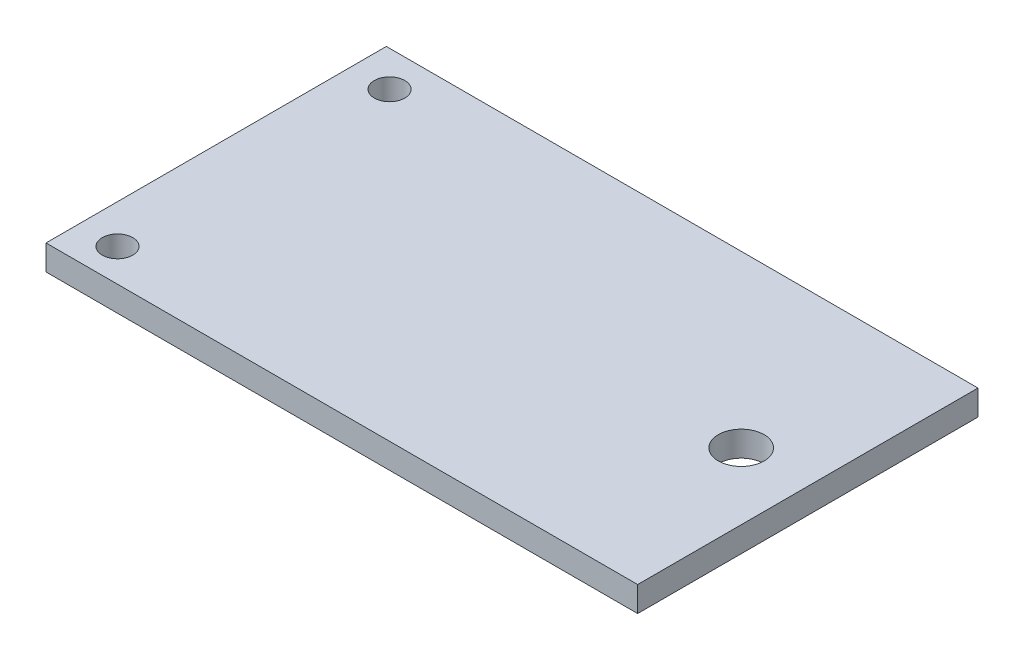
ISO-10303-21;
HEADER;
FILE_DESCRIPTION(('STEP AP214'),'2;1');
FILE_NAME('part.step','',(''),(''),'','','');
FILE_SCHEMA(('AUTOMOTIVE_DESIGN { 1 0 10303 214 1 1 1 1 }'));
ENDSEC;
DATA;
#1=APPLICATION_CONTEXT('core data for automotive mechanical design processes');
#2=APPLICATION_PROTOCOL_DEFINITION('international standard','automotive_design',2000,#1);
#3=PRODUCT_CONTEXT('',#1,'mechanical');
#4=PRODUCT('Part','Part','',(#3));
#5=PRODUCT_RELATED_PRODUCT_CATEGORY('part','',(#4));
#6=PRODUCT_DEFINITION_FORMATION('','',#4);
#7=PRODUCT_DEFINITION_CONTEXT('part definition',#1,'design');
#8=PRODUCT_DEFINITION('design','',#6,#7);
#9=PRODUCT_DEFINITION_SHAPE('','',#8);
#10=(LENGTH_UNIT() NAMED_UNIT(*) SI_UNIT(.MILLI.,.METRE.));
#11=(NAMED_UNIT(*) PLANE_ANGLE_UNIT() SI_UNIT($,.RADIAN.));
#12=(NAMED_UNIT(*) SI_UNIT($,.STERADIAN.) SOLID_ANGLE_UNIT());
#13=UNCERTAINTY_MEASURE_WITH_UNIT(LENGTH_MEASURE(1.E-05),#10,'distance_accuracy_value','');
#14=(GEOMETRIC_REPRESENTATION_CONTEXT(3) GLOBAL_UNCERTAINTY_ASSIGNED_CONTEXT((#13)) GLOBAL_UNIT_ASSIGNED_CONTEXT((#10,
#11,#12)) REPRESENTATION_CONTEXT('',''));
#15=CARTESIAN_POINT('',(0.,0.,0.));
#16=DIRECTION('',(0.,0.,1.));
#17=DIRECTION('',(1.,0.,0.));
#18=AXIS2_PLACEMENT_3D('',#15,#16,#17);
#19=CARTESIAN_POINT('',(34.43,3.2,11.16));
#20=DIRECTION('',(0.,-1.,0.));
#21=DIRECTION('',(-1.,0.,0.));
#22=AXIS2_PLACEMENT_3D('',#19,#20,#21);
#23=CYLINDRICAL_SURFACE('',#22,1.5);
#24=CARTESIAN_POINT('',(34.43,0.,11.16));
#25=DIRECTION('',(0.,1.,0.));
#26=DIRECTION('',(-1.,0.,0.));
#27=AXIS2_PLACEMENT_3D('',#24,#25,#26);
#28=CIRCLE('',#27,1.5);
#29=CARTESIAN_POINT('',(32.93,0.,11.16));
#30=VERTEX_POINT('',#29);
#31=EDGE_CURVE('E94',#30,#30,#28,.T.);
#32=ORIENTED_EDGE('',*,*,#31,.F.);
#33=EDGE_LOOP('',(#32));
#34=FACE_BOUND('',#33,.T.);
#35=CARTESIAN_POINT('',(34.43,1.65,11.16));
#36=DIRECTION('',(0.,-1.,0.));
#37=DIRECTION('',(-1.,0.,0.));
#38=AXIS2_PLACEMENT_3D('',#35,#36,#37);
#39=CIRCLE('',#38,1.5);
#40=CARTESIAN_POINT('',(32.93,1.65,11.16));
#41=VERTEX_POINT('',#40);
#42=EDGE_CURVE('E82',#41,#41,#39,.T.);
#43=ORIENTED_EDGE('',*,*,#42,.F.);
#44=EDGE_LOOP('',(#43));
#45=FACE_BOUND('',#44,.T.);
#46=ADVANCED_FACE('F17',(#34,#45),#23,.F.);
#47=CARTESIAN_POINT('',(2.54,1.65,20.17));
#48=DIRECTION('',(0.,-1.,0.));
#49=DIRECTION('',(-1.,0.,0.));
#50=AXIS2_PLACEMENT_3D('',#47,#48,#49);
#51=CYLINDRICAL_SURFACE('',#50,1.);
#52=CARTESIAN_POINT('',(2.54,0.,20.17));
#53=DIRECTION('',(0.,1.,0.));
#54=DIRECTION('',(-1.,0.,0.));
#55=AXIS2_PLACEMENT_3D('',#52,#53,#54);
#56=CIRCLE('',#55,1.);
#57=CARTESIAN_POINT('',(1.54,0.,20.17));
#58=VERTEX_POINT('',#57);
#59=EDGE_CURVE('E101',#58,#58,#56,.T.);
#60=ORIENTED_EDGE('',*,*,#59,.F.);
#61=EDGE_LOOP('',(#60));
#62=FACE_BOUND('',#61,.T.);
#63=CARTESIAN_POINT('',(2.54,1.65,20.17));
#64=DIRECTION('',(0.,-1.,0.));
#65=DIRECTION('',(-1.,0.,0.));
#66=AXIS2_PLACEMENT_3D('',#63,#64,#65);
#67=CIRCLE('',#66,1.);
#68=CARTESIAN_POINT('',(1.54,1.65,20.17));
#69=VERTEX_POINT('',#68);
#70=EDGE_CURVE('E88',#69,#69,#67,.T.);
#71=ORIENTED_EDGE('',*,*,#70,.F.);
#72=EDGE_LOOP('',(#71));
#73=FACE_BOUND('',#72,.T.);
#74=ADVANCED_FACE('F114',(#62,#73),#51,.F.);
#75=CARTESIAN_POINT('',(2.54,1.65,2.33));
#76=DIRECTION('',(0.,-1.,0.));
#77=DIRECTION('',(-1.,0.,0.));
#78=AXIS2_PLACEMENT_3D('',#75,#76,#77);
#79=CYLINDRICAL_SURFACE('',#78,1.);
#80=CARTESIAN_POINT('',(2.54,0.,2.33));
#81=DIRECTION('',(0.,1.,0.));
#82=DIRECTION('',(-1.,0.,0.));
#83=AXIS2_PLACEMENT_3D('',#80,#81,#82);
#84=CIRCLE('',#83,1.);
#85=CARTESIAN_POINT('',(1.54,0.,2.33));
#86=VERTEX_POINT('',#85);
#87=EDGE_CURVE('E99',#86,#86,#84,.T.);
#88=ORIENTED_EDGE('',*,*,#87,.F.);
#89=EDGE_LOOP('',(#88));
#90=FACE_BOUND('',#89,.T.);
#91=CARTESIAN_POINT('',(2.54,1.65,2.33));
#92=DIRECTION('',(0.,-1.,0.));
#93=DIRECTION('',(-1.,0.,0.));
#94=AXIS2_PLACEMENT_3D('',#91,#92,#93);
#95=CIRCLE('',#94,1.);
#96=CARTESIAN_POINT('',(1.54,1.65,2.33));
#97=VERTEX_POINT('',#96);
#98=EDGE_CURVE('E86',#97,#97,#95,.T.);
#99=ORIENTED_EDGE('',*,*,#98,.F.);
#100=EDGE_LOOP('',(#99));
#101=FACE_BOUND('',#100,.T.);
#102=ADVANCED_FACE('F121',(#90,#101),#79,.F.);
#103=CARTESIAN_POINT('',(0.,0.,0.));
#104=DIRECTION('',(-1.,0.,0.));
#105=DIRECTION('',(0.,0.,1.));
#106=AXIS2_PLACEMENT_3D('',#103,#104,#105);
#107=PLANE('',#106);
#108=DIRECTION('',(0.,0.,-1.));
#109=VECTOR('',#108,1.);
#110=CARTESIAN_POINT('',(0.,0.,22.32));
#111=LINE('',#110,#109);
#112=CARTESIAN_POINT('',(0.,0.,22.32));
#113=VERTEX_POINT('',#112);
#114=CARTESIAN_POINT('',(0.,0.,0.));
#115=VERTEX_POINT('',#114);
#116=EDGE_CURVE('E35',#113,#115,#111,.T.);
#117=ORIENTED_EDGE('',*,*,#116,.F.);
#118=DIRECTION('',(0.,1.,0.));
#119=VECTOR('',#118,1.);
#120=CARTESIAN_POINT('',(0.,0.,22.32));
#121=LINE('',#120,#119);
#122=CARTESIAN_POINT('',(0.,1.65,22.32));
#123=VERTEX_POINT('',#122);
#124=EDGE_CURVE('E11',#113,#123,#121,.T.);
#125=ORIENTED_EDGE('',*,*,#124,.T.);
#126=DIRECTION('',(0.,0.,1.));
#127=VECTOR('',#126,1.);
#128=CARTESIAN_POINT('',(0.,1.65,22.32));
#129=LINE('',#128,#127);
#130=CARTESIAN_POINT('',(0.,1.65,0.));
#131=VERTEX_POINT('',#130);
#132=EDGE_CURVE('E80',#131,#123,#129,.T.);
#133=ORIENTED_EDGE('',*,*,#132,.F.);
#134=DIRECTION('',(0.,1.,0.));
#135=VECTOR('',#134,1.);
#136=CARTESIAN_POINT('',(0.,0.,0.));
#137=LINE('',#136,#135);
#138=EDGE_CURVE('E27',#115,#131,#137,.T.);
#139=ORIENTED_EDGE('',*,*,#138,.F.);
#140=EDGE_LOOP('',(#117,#125,#133,#139));
#141=FACE_BOUND('',#140,.T.);
#142=ADVANCED_FACE('F84',(#141),#107,.T.);
#143=CARTESIAN_POINT('',(38.8,0.,0.));
#144=DIRECTION('',(0.,0.,-1.));
#145=DIRECTION('',(-1.,0.,0.));
#146=AXIS2_PLACEMENT_3D('',#143,#144,#145);
#147=PLANE('',#146);
#148=DIRECTION('',(1.,0.,0.));
#149=VECTOR('',#148,1.);
#150=CARTESIAN_POINT('',(0.,0.,0.));
#151=LINE('',#150,#149);
#152=CARTESIAN_POINT('',(38.8,0.,0.));
#153=VERTEX_POINT('',#152);
#154=EDGE_CURVE('E90',#115,#153,#151,.T.);
#155=ORIENTED_EDGE('',*,*,#154,.F.);
#156=ORIENTED_EDGE('',*,*,#138,.T.);
#157=DIRECTION('',(-1.,0.,0.));
#158=VECTOR('',#157,1.);
#159=CARTESIAN_POINT('',(0.,1.65,0.));
#160=LINE('',#159,#158);
#161=CARTESIAN_POINT('',(38.8,1.65,0.));
#162=VERTEX_POINT('',#161);
#163=EDGE_CURVE('E71',#162,#131,#160,.T.);
#164=ORIENTED_EDGE('',*,*,#163,.F.);
#165=DIRECTION('',(0.,1.,0.));
#166=VECTOR('',#165,1.);
#167=CARTESIAN_POINT('',(38.8,0.,0.));
#168=LINE('',#167,#166);
#169=EDGE_CURVE('E67',#153,#162,#168,.T.);
#170=ORIENTED_EDGE('',*,*,#169,.F.);
#171=EDGE_LOOP('',(#155,#156,#164,#170));
#172=FACE_BOUND('',#171,.T.);
#173=ADVANCED_FACE('F131',(#172),#147,.T.);
#174=CARTESIAN_POINT('',(38.8,0.,22.32));
#175=DIRECTION('',(1.,0.,0.));
#176=DIRECTION('',(0.,0.,-1.));
#177=AXIS2_PLACEMENT_3D('',#174,#175,#176);
#178=PLANE('',#177);
#179=DIRECTION('',(0.,0.,1.));
#180=VECTOR('',#179,1.);
#181=CARTESIAN_POINT('',(38.8,0.,0.));
#182=LINE('',#181,#180);
#183=CARTESIAN_POINT('',(38.8,0.,22.32));
#184=VERTEX_POINT('',#183);
#185=EDGE_CURVE('E55',#153,#184,#182,.T.);
#186=ORIENTED_EDGE('',*,*,#185,.F.);
#187=ORIENTED_EDGE('',*,*,#169,.T.);
#188=DIRECTION('',(0.,0.,-1.));
#189=VECTOR('',#188,1.);
#190=CARTESIAN_POINT('',(38.8,1.65,0.));
#191=LINE('',#190,#189);
#192=CARTESIAN_POINT('',(38.8,1.65,22.32));
#193=VERTEX_POINT('',#192);
#194=EDGE_CURVE('E61',#193,#162,#191,.T.);
#195=ORIENTED_EDGE('',*,*,#194,.F.);
#196=DIRECTION('',(0.,1.,0.));
#197=VECTOR('',#196,1.);
#198=CARTESIAN_POINT('',(38.8,0.,22.32));
#199=LINE('',#198,#197);
#200=EDGE_CURVE('E64',#184,#193,#199,.T.);
#201=ORIENTED_EDGE('',*,*,#200,.F.);
#202=EDGE_LOOP('',(#186,#187,#195,#201));
#203=FACE_BOUND('',#202,.T.);
#204=ADVANCED_FACE('F63',(#203),#178,.T.);
#205=CARTESIAN_POINT('',(0.,0.,22.32));
#206=DIRECTION('',(0.,0.,1.));
#207=DIRECTION('',(1.,0.,0.));
#208=AXIS2_PLACEMENT_3D('',#205,#206,#207);
#209=PLANE('',#208);
#210=DIRECTION('',(-1.,0.,0.));
#211=VECTOR('',#210,1.);
#212=CARTESIAN_POINT('',(38.8,0.,22.32));
#213=LINE('',#212,#211);
#214=EDGE_CURVE('E76',#184,#113,#213,.T.);
#215=ORIENTED_EDGE('',*,*,#214,.F.);
#216=ORIENTED_EDGE('',*,*,#200,.T.);
#217=DIRECTION('',(1.,0.,0.));
#218=VECTOR('',#217,1.);
#219=CARTESIAN_POINT('',(38.8,1.65,22.32));
#220=LINE('',#219,#218);
#221=EDGE_CURVE('E21',#123,#193,#220,.T.);
#222=ORIENTED_EDGE('',*,*,#221,.F.);
#223=ORIENTED_EDGE('',*,*,#124,.F.);
#224=EDGE_LOOP('',(#215,#216,#222,#223));
#225=FACE_BOUND('',#224,.T.);
#226=ADVANCED_FACE('F75',(#225),#209,.T.);
#227=CARTESIAN_POINT('',(19.4,1.65,11.16));
#228=DIRECTION('',(0.,1.,0.));
#229=DIRECTION('',(0.,0.,1.));
#230=AXIS2_PLACEMENT_3D('',#227,#228,#229);
#231=PLANE('',#230);
#232=ORIENTED_EDGE('',*,*,#221,.T.);
#233=ORIENTED_EDGE('',*,*,#194,.T.);
#234=ORIENTED_EDGE('',*,*,#163,.T.);
#235=ORIENTED_EDGE('',*,*,#132,.T.);
#236=EDGE_LOOP('',(#232,#233,#234,#235));
#237=FACE_BOUND('',#236,.T.);
#238=ORIENTED_EDGE('',*,*,#42,.T.);
#239=EDGE_LOOP('',(#238));
#240=FACE_BOUND('',#239,.T.);
#241=ORIENTED_EDGE('',*,*,#70,.T.);
#242=EDGE_LOOP('',(#241));
#243=FACE_BOUND('',#242,.T.);
#244=ORIENTED_EDGE('',*,*,#98,.T.);
#245=EDGE_LOOP('',(#244));
#246=FACE_BOUND('',#245,.T.);
#247=ADVANCED_FACE('F78',(#237,#240,#243,#246),#231,.T.);
#248=CARTESIAN_POINT('',(19.4,0.,11.16));
#249=DIRECTION('',(0.,1.,0.));
#250=DIRECTION('',(1.,0.,0.));
#251=AXIS2_PLACEMENT_3D('',#248,#249,#250);
#252=PLANE('',#251);
#253=ORIENTED_EDGE('',*,*,#214,.T.);
#254=ORIENTED_EDGE('',*,*,#116,.T.);
#255=ORIENTED_EDGE('',*,*,#154,.T.);
#256=ORIENTED_EDGE('',*,*,#185,.T.);
#257=EDGE_LOOP('',(#253,#254,#255,#256));
#258=FACE_BOUND('',#257,.T.);
#259=ORIENTED_EDGE('',*,*,#31,.T.);
#260=EDGE_LOOP('',(#259));
#261=FACE_BOUND('',#260,.T.);
#262=ORIENTED_EDGE('',*,*,#59,.T.);
#263=EDGE_LOOP('',(#262));
#264=FACE_BOUND('',#263,.T.);
#265=ORIENTED_EDGE('',*,*,#87,.T.);
#266=EDGE_LOOP('',(#265));
#267=FACE_BOUND('',#266,.T.);
#268=ADVANCED_FACE('F19',(#258,#261,#264,#267),#252,.F.);
#269=CLOSED_SHELL('',(#46,#74,#102,#142,#173,#204,#226,#247,#268));
#270=MANIFOLD_SOLID_BREP('B1',#269);
#271=ADVANCED_BREP_SHAPE_REPRESENTATION('',(#18,#270),#14);
#272=SHAPE_DEFINITION_REPRESENTATION(#9,#271);
ENDSEC;
END-ISO-10303-21;
